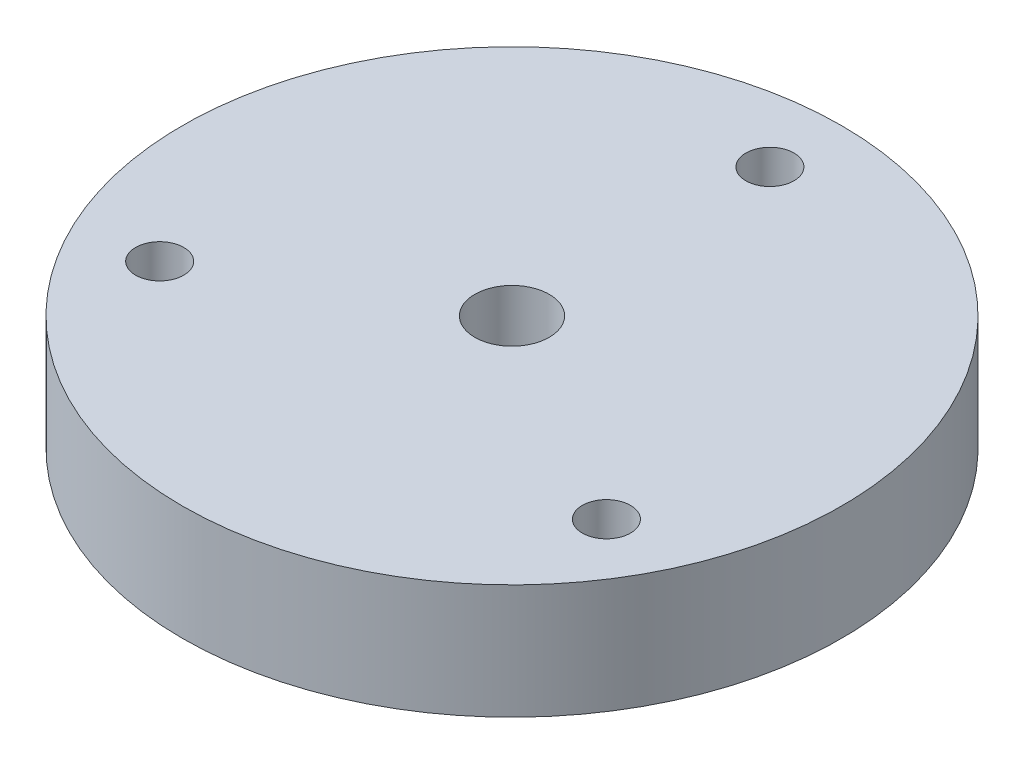
ISO-10303-21;
HEADER;
FILE_DESCRIPTION(('STEP AP214'),'2;1');
FILE_NAME('part.step','',(''),(''),'','','');
FILE_SCHEMA(('AUTOMOTIVE_DESIGN { 1 0 10303 214 1 1 1 1 }'));
ENDSEC;
DATA;
#1=APPLICATION_CONTEXT('core data for automotive mechanical design processes');
#2=APPLICATION_PROTOCOL_DEFINITION('international standard','automotive_design',2000,#1);
#3=PRODUCT_CONTEXT('',#1,'mechanical');
#4=PRODUCT('Part','Part','',(#3));
#5=PRODUCT_RELATED_PRODUCT_CATEGORY('part','',(#4));
#6=PRODUCT_DEFINITION_FORMATION('','',#4);
#7=PRODUCT_DEFINITION_CONTEXT('part definition',#1,'design');
#8=PRODUCT_DEFINITION('design','',#6,#7);
#9=PRODUCT_DEFINITION_SHAPE('','',#8);
#10=(LENGTH_UNIT() NAMED_UNIT(*) SI_UNIT(.MILLI.,.METRE.));
#11=(NAMED_UNIT(*) PLANE_ANGLE_UNIT() SI_UNIT($,.RADIAN.));
#12=(NAMED_UNIT(*) SI_UNIT($,.STERADIAN.) SOLID_ANGLE_UNIT());
#13=UNCERTAINTY_MEASURE_WITH_UNIT(LENGTH_MEASURE(1.E-05),#10,'distance_accuracy_value','');
#14=(GEOMETRIC_REPRESENTATION_CONTEXT(3) GLOBAL_UNCERTAINTY_ASSIGNED_CONTEXT((#13)) GLOBAL_UNIT_ASSIGNED_CONTEXT((#10,
#11,#12)) REPRESENTATION_CONTEXT('',''));
#15=CARTESIAN_POINT('',(0.,0.,0.));
#16=DIRECTION('',(0.,0.,1.));
#17=DIRECTION('',(1.,0.,0.));
#18=AXIS2_PLACEMENT_3D('',#15,#16,#17);
#19=CARTESIAN_POINT('',(0.,10.,0.));
#20=DIRECTION('',(0.,1.,0.));
#21=DIRECTION('',(0.,0.,1.));
#22=AXIS2_PLACEMENT_3D('',#19,#20,#21);
#23=PLANE('',#22);
#24=CARTESIAN_POINT('',(19.4855715851513,10.,11.2499999999992));
#25=DIRECTION('',(0.,1.,0.));
#26=DIRECTION('',(0.,0.,1.));
#27=AXIS2_PLACEMENT_3D('',#24,#25,#26);
#28=CIRCLE('',#27,2.10000000000123);
#29=CARTESIAN_POINT('',(19.4855715851513,10.,13.3500000000004));
#30=VERTEX_POINT('',#29);
#31=EDGE_CURVE('E70',#30,#30,#28,.T.);
#32=ORIENTED_EDGE('',*,*,#31,.F.);
#33=EDGE_LOOP('',(#32));
#34=FACE_BOUND('',#33,.T.);
#35=CARTESIAN_POINT('',(0.,10.,0.));
#36=DIRECTION('',(0.,1.,0.));
#37=DIRECTION('',(0.,0.,1.));
#38=AXIS2_PLACEMENT_3D('',#35,#36,#37);
#39=CIRCLE('',#38,3.25);
#40=CARTESIAN_POINT('',(0.,10.,3.25));
#41=VERTEX_POINT('',#40);
#42=EDGE_CURVE('E56',#41,#41,#39,.T.);
#43=ORIENTED_EDGE('',*,*,#42,.F.);
#44=EDGE_LOOP('',(#43));
#45=FACE_BOUND('',#44,.T.);
#46=CARTESIAN_POINT('',(0.,10.,0.));
#47=DIRECTION('',(0.,1.,0.));
#48=DIRECTION('',(0.,0.,1.));
#49=AXIS2_PLACEMENT_3D('',#46,#47,#48);
#50=CIRCLE('',#49,28.75);
#51=CARTESIAN_POINT('',(0.,10.,28.75));
#52=VERTEX_POINT('',#51);
#53=EDGE_CURVE('E10',#52,#52,#50,.T.);
#54=ORIENTED_EDGE('',*,*,#53,.T.);
#55=EDGE_LOOP('',(#54));
#56=FACE_BOUND('',#55,.T.);
#57=CARTESIAN_POINT('',(0.,10.,-22.5));
#58=DIRECTION('',(0.,1.,0.));
#59=DIRECTION('',(0.,0.,1.));
#60=AXIS2_PLACEMENT_3D('',#57,#58,#59);
#61=CIRCLE('',#60,2.1);
#62=CARTESIAN_POINT('',(0.,10.,-20.4));
#63=VERTEX_POINT('',#62);
#64=EDGE_CURVE('E62',#63,#63,#61,.T.);
#65=ORIENTED_EDGE('',*,*,#64,.F.);
#66=EDGE_LOOP('',(#65));
#67=FACE_BOUND('',#66,.T.);
#68=CARTESIAN_POINT('',(-19.4855715851484,10.,11.2500000000008));
#69=DIRECTION('',(0.,1.,0.));
#70=DIRECTION('',(0.,0.,1.));
#71=AXIS2_PLACEMENT_3D('',#68,#69,#70);
#72=CIRCLE('',#71,2.10000000000181);
#73=CARTESIAN_POINT('',(-19.4855715851484,10.,13.3500000000026));
#74=VERTEX_POINT('',#73);
#75=EDGE_CURVE('E78',#74,#74,#72,.T.);
#76=ORIENTED_EDGE('',*,*,#75,.F.);
#77=EDGE_LOOP('',(#76));
#78=FACE_BOUND('',#77,.T.);
#79=ADVANCED_FACE('F43',(#34,#45,#56,#67,#78),#23,.T.);
#80=CARTESIAN_POINT('',(0.,0.,0.));
#81=DIRECTION('',(0.,1.,0.));
#82=DIRECTION('',(0.,0.,1.));
#83=AXIS2_PLACEMENT_3D('',#80,#81,#82);
#84=PLANE('',#83);
#85=CARTESIAN_POINT('',(0.,0.,0.));
#86=DIRECTION('',(0.,1.,0.));
#87=DIRECTION('',(0.,0.,1.));
#88=AXIS2_PLACEMENT_3D('',#85,#86,#87);
#89=CIRCLE('',#88,28.75);
#90=CARTESIAN_POINT('',(0.,0.,28.75));
#91=VERTEX_POINT('',#90);
#92=EDGE_CURVE('E47',#91,#91,#89,.T.);
#93=ORIENTED_EDGE('',*,*,#92,.F.);
#94=EDGE_LOOP('',(#93));
#95=FACE_BOUND('',#94,.T.);
#96=CARTESIAN_POINT('',(0.,0.,0.));
#97=DIRECTION('',(0.,1.,0.));
#98=DIRECTION('',(0.,0.,1.));
#99=AXIS2_PLACEMENT_3D('',#96,#97,#98);
#100=CIRCLE('',#99,3.25);
#101=CARTESIAN_POINT('',(0.,0.,3.25));
#102=VERTEX_POINT('',#101);
#103=EDGE_CURVE('E58',#102,#102,#100,.T.);
#104=ORIENTED_EDGE('',*,*,#103,.T.);
#105=EDGE_LOOP('',(#104));
#106=FACE_BOUND('',#105,.T.);
#107=CARTESIAN_POINT('',(0.,0.,-22.5));
#108=DIRECTION('',(0.,1.,0.));
#109=DIRECTION('',(0.,0.,1.));
#110=AXIS2_PLACEMENT_3D('',#107,#108,#109);
#111=CIRCLE('',#110,2.1);
#112=CARTESIAN_POINT('',(0.,0.,-20.4));
#113=VERTEX_POINT('',#112);
#114=EDGE_CURVE('E66',#113,#113,#111,.T.);
#115=ORIENTED_EDGE('',*,*,#114,.T.);
#116=EDGE_LOOP('',(#115));
#117=FACE_BOUND('',#116,.T.);
#118=CARTESIAN_POINT('',(19.4855715851513,0.,11.2499999999992));
#119=DIRECTION('',(0.,1.,0.));
#120=DIRECTION('',(0.,0.,1.));
#121=AXIS2_PLACEMENT_3D('',#118,#119,#120);
#122=CIRCLE('',#121,2.10000000000123);
#123=CARTESIAN_POINT('',(19.4855715851513,0.,13.3500000000004));
#124=VERTEX_POINT('',#123);
#125=EDGE_CURVE('E74',#124,#124,#122,.T.);
#126=ORIENTED_EDGE('',*,*,#125,.T.);
#127=EDGE_LOOP('',(#126));
#128=FACE_BOUND('',#127,.T.);
#129=CARTESIAN_POINT('',(-19.4855715851484,0.,11.2500000000008));
#130=DIRECTION('',(0.,1.,0.));
#131=DIRECTION('',(0.,0.,1.));
#132=AXIS2_PLACEMENT_3D('',#129,#130,#131);
#133=CIRCLE('',#132,2.10000000000181);
#134=CARTESIAN_POINT('',(-19.4855715851484,0.,13.3500000000026));
#135=VERTEX_POINT('',#134);
#136=EDGE_CURVE('E82',#135,#135,#133,.T.);
#137=ORIENTED_EDGE('',*,*,#136,.T.);
#138=EDGE_LOOP('',(#137));
#139=FACE_BOUND('',#138,.T.);
#140=ADVANCED_FACE('F94',(#95,#106,#117,#128,#139),#84,.F.);
#141=CARTESIAN_POINT('',(0.,10.,0.));
#142=DIRECTION('',(0.,-1.,0.));
#143=DIRECTION('',(0.,0.,-1.));
#144=AXIS2_PLACEMENT_3D('',#141,#142,#143);
#145=CYLINDRICAL_SURFACE('',#144,28.75);
#146=ORIENTED_EDGE('',*,*,#53,.F.);
#147=EDGE_LOOP('',(#146));
#148=FACE_BOUND('',#147,.T.);
#149=ORIENTED_EDGE('',*,*,#92,.T.);
#150=EDGE_LOOP('',(#149));
#151=FACE_BOUND('',#150,.T.);
#152=ADVANCED_FACE('F45',(#148,#151),#145,.T.);
#153=CARTESIAN_POINT('',(0.,10.,0.));
#154=DIRECTION('',(0.,-1.,0.));
#155=DIRECTION('',(0.,0.,-1.));
#156=AXIS2_PLACEMENT_3D('',#153,#154,#155);
#157=CYLINDRICAL_SURFACE('',#156,3.25);
#158=ORIENTED_EDGE('',*,*,#42,.T.);
#159=EDGE_LOOP('',(#158));
#160=FACE_BOUND('',#159,.T.);
#161=ORIENTED_EDGE('',*,*,#103,.F.);
#162=EDGE_LOOP('',(#161));
#163=FACE_BOUND('',#162,.T.);
#164=ADVANCED_FACE('F104',(#160,#163),#157,.F.);
#165=CARTESIAN_POINT('',(0.,10.,-22.5));
#166=DIRECTION('',(0.,-1.,0.));
#167=DIRECTION('',(0.,0.,-1.));
#168=AXIS2_PLACEMENT_3D('',#165,#166,#167);
#169=CYLINDRICAL_SURFACE('',#168,2.1);
#170=ORIENTED_EDGE('',*,*,#64,.T.);
#171=EDGE_LOOP('',(#170));
#172=FACE_BOUND('',#171,.T.);
#173=ORIENTED_EDGE('',*,*,#114,.F.);
#174=EDGE_LOOP('',(#173));
#175=FACE_BOUND('',#174,.T.);
#176=ADVANCED_FACE('F107',(#172,#175),#169,.F.);
#177=CARTESIAN_POINT('',(19.4855715851513,10.,11.2499999999992));
#178=DIRECTION('',(0.,-1.,0.));
#179=DIRECTION('',(0.,0.,-1.));
#180=AXIS2_PLACEMENT_3D('',#177,#178,#179);
#181=CYLINDRICAL_SURFACE('',#180,2.10000000000123);
#182=ORIENTED_EDGE('',*,*,#31,.T.);
#183=EDGE_LOOP('',(#182));
#184=FACE_BOUND('',#183,.T.);
#185=ORIENTED_EDGE('',*,*,#125,.F.);
#186=EDGE_LOOP('',(#185));
#187=FACE_BOUND('',#186,.T.);
#188=ADVANCED_FACE('F111',(#184,#187),#181,.F.);
#189=CARTESIAN_POINT('',(-19.4855715851484,10.,11.2500000000008));
#190=DIRECTION('',(0.,-1.,0.));
#191=DIRECTION('',(0.,0.,-1.));
#192=AXIS2_PLACEMENT_3D('',#189,#190,#191);
#193=CYLINDRICAL_SURFACE('',#192,2.10000000000181);
#194=ORIENTED_EDGE('',*,*,#75,.T.);
#195=EDGE_LOOP('',(#194));
#196=FACE_BOUND('',#195,.T.);
#197=ORIENTED_EDGE('',*,*,#136,.F.);
#198=EDGE_LOOP('',(#197));
#199=FACE_BOUND('',#198,.T.);
#200=ADVANCED_FACE('F90',(#196,#199),#193,.F.);
#201=CLOSED_SHELL('',(#79,#140,#152,#164,#176,#188,#200));
#202=MANIFOLD_SOLID_BREP('B2',#201);
#203=ADVANCED_BREP_SHAPE_REPRESENTATION('',(#18,#202),#14);
#204=SHAPE_DEFINITION_REPRESENTATION(#9,#203);
ENDSEC;
END-ISO-10303-21;
